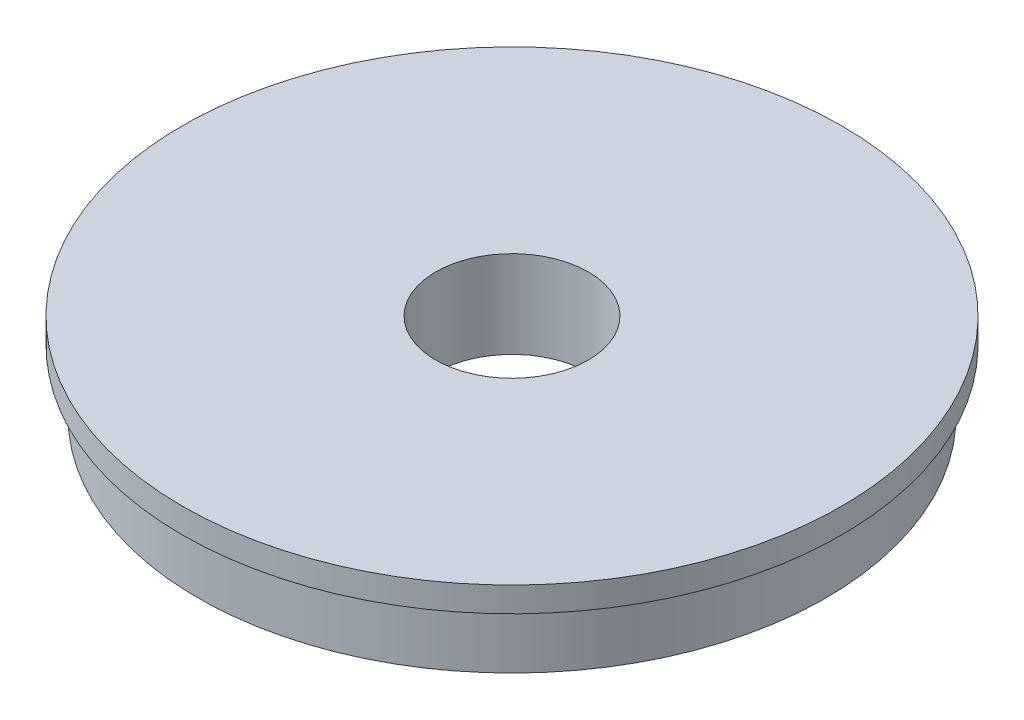
ISO-10303-21;
HEADER;
FILE_DESCRIPTION(('STEP AP214'),'2;1');
FILE_NAME('part.step','',(''),(''),'','','');
FILE_SCHEMA(('AUTOMOTIVE_DESIGN { 1 0 10303 214 1 1 1 1 }'));
ENDSEC;
DATA;
#1=APPLICATION_CONTEXT('core data for automotive mechanical design processes');
#2=APPLICATION_PROTOCOL_DEFINITION('international standard','automotive_design',2000,#1);
#3=PRODUCT_CONTEXT('',#1,'mechanical');
#4=PRODUCT('Part','Part','',(#3));
#5=PRODUCT_RELATED_PRODUCT_CATEGORY('part','',(#4));
#6=PRODUCT_DEFINITION_FORMATION('','',#4);
#7=PRODUCT_DEFINITION_CONTEXT('part definition',#1,'design');
#8=PRODUCT_DEFINITION('design','',#6,#7);
#9=PRODUCT_DEFINITION_SHAPE('','',#8);
#10=(LENGTH_UNIT() NAMED_UNIT(*) SI_UNIT(.MILLI.,.METRE.));
#11=(NAMED_UNIT(*) PLANE_ANGLE_UNIT() SI_UNIT($,.RADIAN.));
#12=(NAMED_UNIT(*) SI_UNIT($,.STERADIAN.) SOLID_ANGLE_UNIT());
#13=UNCERTAINTY_MEASURE_WITH_UNIT(LENGTH_MEASURE(1.E-05),#10,'distance_accuracy_value','');
#14=(GEOMETRIC_REPRESENTATION_CONTEXT(3) GLOBAL_UNCERTAINTY_ASSIGNED_CONTEXT((#13)) GLOBAL_UNIT_ASSIGNED_CONTEXT((#10,
#11,#12)) REPRESENTATION_CONTEXT('',''));
#15=CARTESIAN_POINT('',(0.,0.,0.));
#16=DIRECTION('',(0.,0.,1.));
#17=DIRECTION('',(1.,0.,0.));
#18=AXIS2_PLACEMENT_3D('',#15,#16,#17);
#19=CARTESIAN_POINT('',(0.,0.,0.));
#20=DIRECTION('',(0.,1.,0.));
#21=DIRECTION('',(0.,0.,-1.));
#22=AXIS2_PLACEMENT_3D('',#19,#20,#21);
#23=PLANE('',#22);
#24=CARTESIAN_POINT('',(0.,0.,0.));
#25=DIRECTION('',(0.,-1.,0.));
#26=DIRECTION('',(0.,0.,-1.));
#27=AXIS2_PLACEMENT_3D('',#24,#25,#26);
#28=CIRCLE('',#27,10.075);
#29=CARTESIAN_POINT('',(0.,0.,-10.075));
#30=VERTEX_POINT('',#29);
#31=EDGE_CURVE('E45',#30,#30,#28,.T.);
#32=ORIENTED_EDGE('',*,*,#31,.T.);
#33=EDGE_LOOP('',(#32));
#34=FACE_BOUND('',#33,.T.);
#35=CARTESIAN_POINT('',(0.,0.,0.));
#36=DIRECTION('',(0.,-1.,0.));
#37=DIRECTION('',(0.,0.,-1.));
#38=AXIS2_PLACEMENT_3D('',#35,#36,#37);
#39=CIRCLE('',#38,2.45);
#40=CARTESIAN_POINT('',(0.,0.,-2.45));
#41=VERTEX_POINT('',#40);
#42=EDGE_CURVE('E52',#41,#41,#39,.T.);
#43=ORIENTED_EDGE('',*,*,#42,.F.);
#44=EDGE_LOOP('',(#43));
#45=FACE_BOUND('',#44,.T.);
#46=ADVANCED_FACE('F41',(#34,#45),#23,.F.);
#47=CARTESIAN_POINT('',(0.,2.,0.));
#48=DIRECTION('',(0.,-1.,0.));
#49=DIRECTION('',(0.,0.,1.));
#50=AXIS2_PLACEMENT_3D('',#47,#48,#49);
#51=CYLINDRICAL_SURFACE('',#50,10.075);
#52=CARTESIAN_POINT('',(0.,2.,0.));
#53=DIRECTION('',(0.,-1.,0.));
#54=DIRECTION('',(0.,0.,-1.));
#55=AXIS2_PLACEMENT_3D('',#52,#53,#54);
#56=CIRCLE('',#55,10.075);
#57=CARTESIAN_POINT('',(0.,2.,-10.075));
#58=VERTEX_POINT('',#57);
#59=EDGE_CURVE('E10',#58,#58,#56,.T.);
#60=ORIENTED_EDGE('',*,*,#59,.T.);
#61=EDGE_LOOP('',(#60));
#62=FACE_BOUND('',#61,.T.);
#63=ORIENTED_EDGE('',*,*,#31,.F.);
#64=EDGE_LOOP('',(#63));
#65=FACE_BOUND('',#64,.T.);
#66=ADVANCED_FACE('F43',(#62,#65),#51,.T.);
#67=CARTESIAN_POINT('',(0.,2.,0.));
#68=DIRECTION('',(0.,-1.,0.));
#69=DIRECTION('',(0.,0.,1.));
#70=AXIS2_PLACEMENT_3D('',#67,#68,#69);
#71=CYLINDRICAL_SURFACE('',#70,2.45);
#72=ORIENTED_EDGE('',*,*,#42,.T.);
#73=EDGE_LOOP('',(#72));
#74=FACE_BOUND('',#73,.T.);
#75=CARTESIAN_POINT('',(0.,2.8,0.));
#76=DIRECTION('',(0.,-1.,0.));
#77=DIRECTION('',(0.,0.,-1.));
#78=AXIS2_PLACEMENT_3D('',#75,#76,#77);
#79=CIRCLE('',#78,2.45);
#80=CARTESIAN_POINT('',(0.,2.8,-2.45));
#81=VERTEX_POINT('',#80);
#82=EDGE_CURVE('E60',#81,#81,#79,.T.);
#83=ORIENTED_EDGE('',*,*,#82,.F.);
#84=EDGE_LOOP('',(#83));
#85=FACE_BOUND('',#84,.T.);
#86=ADVANCED_FACE('F68',(#74,#85),#71,.F.);
#87=CARTESIAN_POINT('',(0.,2.8,0.));
#88=DIRECTION('',(0.,1.,0.));
#89=DIRECTION('',(0.,0.,-1.));
#90=AXIS2_PLACEMENT_3D('',#87,#88,#89);
#91=PLANE('',#90);
#92=CARTESIAN_POINT('',(0.,2.8,0.));
#93=DIRECTION('',(0.,-1.,0.));
#94=DIRECTION('',(0.,0.,-1.));
#95=AXIS2_PLACEMENT_3D('',#92,#93,#94);
#96=CIRCLE('',#95,10.575);
#97=CARTESIAN_POINT('',(0.,2.8,-10.575));
#98=VERTEX_POINT('',#97);
#99=EDGE_CURVE('E56',#98,#98,#96,.T.);
#100=ORIENTED_EDGE('',*,*,#99,.F.);
#101=EDGE_LOOP('',(#100));
#102=FACE_BOUND('',#101,.T.);
#103=ORIENTED_EDGE('',*,*,#82,.T.);
#104=EDGE_LOOP('',(#103));
#105=FACE_BOUND('',#104,.T.);
#106=ADVANCED_FACE('F66',(#102,#105),#91,.T.);
#107=CARTESIAN_POINT('',(0.,2.,0.));
#108=DIRECTION('',(0.,1.,0.));
#109=DIRECTION('',(0.,0.,-1.));
#110=AXIS2_PLACEMENT_3D('',#107,#108,#109);
#111=PLANE('',#110);
#112=ORIENTED_EDGE('',*,*,#59,.F.);
#113=EDGE_LOOP('',(#112));
#114=FACE_BOUND('',#113,.T.);
#115=CARTESIAN_POINT('',(0.,2.,0.));
#116=DIRECTION('',(0.,-1.,0.));
#117=DIRECTION('',(0.,0.,-1.));
#118=AXIS2_PLACEMENT_3D('',#115,#116,#117);
#119=CIRCLE('',#118,10.575);
#120=CARTESIAN_POINT('',(0.,2.,-10.575));
#121=VERTEX_POINT('',#120);
#122=EDGE_CURVE('E57',#121,#121,#119,.T.);
#123=ORIENTED_EDGE('',*,*,#122,.T.);
#124=EDGE_LOOP('',(#123));
#125=FACE_BOUND('',#124,.T.);
#126=ADVANCED_FACE('F76',(#114,#125),#111,.F.);
#127=CARTESIAN_POINT('',(0.,2.8,0.));
#128=DIRECTION('',(0.,-1.,0.));
#129=DIRECTION('',(0.,0.,1.));
#130=AXIS2_PLACEMENT_3D('',#127,#128,#129);
#131=CYLINDRICAL_SURFACE('',#130,10.575);
#132=ORIENTED_EDGE('',*,*,#99,.T.);
#133=EDGE_LOOP('',(#132));
#134=FACE_BOUND('',#133,.T.);
#135=ORIENTED_EDGE('',*,*,#122,.F.);
#136=EDGE_LOOP('',(#135));
#137=FACE_BOUND('',#136,.T.);
#138=ADVANCED_FACE('F117',(#134,#137),#131,.T.);
#139=CLOSED_SHELL('',(#46,#66,#86,#106,#126,#138));
#140=MANIFOLD_SOLID_BREP('B2',#139);
#141=ADVANCED_BREP_SHAPE_REPRESENTATION('',(#18,#140),#14);
#142=SHAPE_DEFINITION_REPRESENTATION(#9,#141);
ENDSEC;
END-ISO-10303-21;
